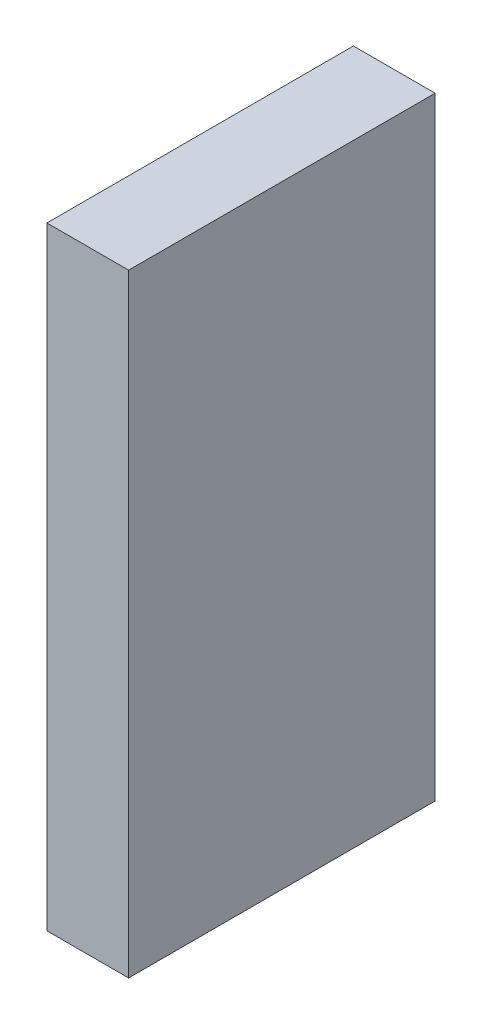
ISO-10303-21;
HEADER;
FILE_DESCRIPTION(('STEP AP214'),'2;1');
FILE_NAME('part.step','',(''),(''),'','','');
FILE_SCHEMA(('AUTOMOTIVE_DESIGN { 1 0 10303 214 1 1 1 1 }'));
ENDSEC;
DATA;
#1=APPLICATION_CONTEXT('core data for automotive mechanical design processes');
#2=APPLICATION_PROTOCOL_DEFINITION('international standard','automotive_design',2000,#1);
#3=PRODUCT_CONTEXT('',#1,'mechanical');
#4=PRODUCT('Part','Part','',(#3));
#5=PRODUCT_RELATED_PRODUCT_CATEGORY('part','',(#4));
#6=PRODUCT_DEFINITION_FORMATION('','',#4);
#7=PRODUCT_DEFINITION_CONTEXT('part definition',#1,'design');
#8=PRODUCT_DEFINITION('design','',#6,#7);
#9=PRODUCT_DEFINITION_SHAPE('','',#8);
#10=(LENGTH_UNIT() NAMED_UNIT(*) SI_UNIT(.MILLI.,.METRE.));
#11=(NAMED_UNIT(*) PLANE_ANGLE_UNIT() SI_UNIT($,.RADIAN.));
#12=(NAMED_UNIT(*) SI_UNIT($,.STERADIAN.) SOLID_ANGLE_UNIT());
#13=UNCERTAINTY_MEASURE_WITH_UNIT(LENGTH_MEASURE(1.E-05),#10,'distance_accuracy_value','');
#14=(GEOMETRIC_REPRESENTATION_CONTEXT(3) GLOBAL_UNCERTAINTY_ASSIGNED_CONTEXT((#13)) GLOBAL_UNIT_ASSIGNED_CONTEXT((#10,
#11,#12)) REPRESENTATION_CONTEXT('',''));
#15=CARTESIAN_POINT('',(0.,0.,0.));
#16=DIRECTION('',(0.,0.,1.));
#17=DIRECTION('',(1.,0.,0.));
#18=AXIS2_PLACEMENT_3D('',#15,#16,#17);
#19=CARTESIAN_POINT('',(4.,54.5304312197874,72.7494152004124));
#20=DIRECTION('',(0.,0.,-1.));
#21=DIRECTION('',(0.,1.,0.));
#22=AXIS2_PLACEMENT_3D('',#19,#20,#21);
#23=PLANE('',#22);
#24=DIRECTION('',(0.,-1.,0.));
#25=VECTOR('',#24,1.);
#26=CARTESIAN_POINT('',(0.,54.5304312197874,72.7494152004124));
#27=LINE('',#26,#25);
#28=CARTESIAN_POINT('',(0.,54.5304312197874,72.7494152004124));
#29=VERTEX_POINT('',#28);
#30=CARTESIAN_POINT('',(0.,24.5304312197874,72.7494152004124));
#31=VERTEX_POINT('',#30);
#32=EDGE_CURVE('E95',#29,#31,#27,.T.);
#33=ORIENTED_EDGE('',*,*,#32,.T.);
#34=DIRECTION('',(-1.,0.,0.));
#35=VECTOR('',#34,1.);
#36=CARTESIAN_POINT('',(4.,24.5304312197874,72.7494152004124));
#37=LINE('',#36,#35);
#38=CARTESIAN_POINT('',(4.,24.5304312197874,72.7494152004124));
#39=VERTEX_POINT('',#38);
#40=EDGE_CURVE('E11',#39,#31,#37,.T.);
#41=ORIENTED_EDGE('',*,*,#40,.F.);
#42=DIRECTION('',(0.,-1.,0.));
#43=VECTOR('',#42,1.);
#44=CARTESIAN_POINT('',(4.,54.5304312197874,72.7494152004124));
#45=LINE('',#44,#43);
#46=CARTESIAN_POINT('',(4.,54.5304312197874,72.7494152004124));
#47=VERTEX_POINT('',#46);
#48=EDGE_CURVE('E83',#47,#39,#45,.T.);
#49=ORIENTED_EDGE('',*,*,#48,.F.);
#50=DIRECTION('',(-1.,0.,0.));
#51=VECTOR('',#50,1.);
#52=CARTESIAN_POINT('',(4.,54.5304312197874,72.7494152004124));
#53=LINE('',#52,#51);
#54=EDGE_CURVE('E91',#47,#29,#53,.T.);
#55=ORIENTED_EDGE('',*,*,#54,.T.);
#56=EDGE_LOOP('',(#33,#41,#49,#55));
#57=FACE_BOUND('',#56,.T.);
#58=ADVANCED_FACE('F32',(#57),#23,.F.);
#59=CARTESIAN_POINT('',(4.,24.5304312197874,72.7494152004124));
#60=DIRECTION('',(0.,1.,0.));
#61=DIRECTION('',(0.,0.,1.));
#62=AXIS2_PLACEMENT_3D('',#59,#60,#61);
#63=PLANE('',#62);
#64=DIRECTION('',(0.,0.,-1.));
#65=VECTOR('',#64,1.);
#66=CARTESIAN_POINT('',(0.,24.5304312197874,72.7494152004124));
#67=LINE('',#66,#65);
#68=CARTESIAN_POINT('',(0.,24.5304312197874,57.7494152004124));
#69=VERTEX_POINT('',#68);
#70=EDGE_CURVE('E87',#31,#69,#67,.T.);
#71=ORIENTED_EDGE('',*,*,#70,.T.);
#72=DIRECTION('',(-1.,0.,0.));
#73=VECTOR('',#72,1.);
#74=CARTESIAN_POINT('',(4.,24.5304312197874,57.7494152004124));
#75=LINE('',#74,#73);
#76=CARTESIAN_POINT('',(4.,24.5304312197874,57.7494152004124));
#77=VERTEX_POINT('',#76);
#78=EDGE_CURVE('E40',#77,#69,#75,.T.);
#79=ORIENTED_EDGE('',*,*,#78,.F.);
#80=DIRECTION('',(0.,0.,-1.));
#81=VECTOR('',#80,1.);
#82=CARTESIAN_POINT('',(4.,24.5304312197874,72.7494152004124));
#83=LINE('',#82,#81);
#84=EDGE_CURVE('E78',#39,#77,#83,.T.);
#85=ORIENTED_EDGE('',*,*,#84,.F.);
#86=ORIENTED_EDGE('',*,*,#40,.T.);
#87=EDGE_LOOP('',(#71,#79,#85,#86));
#88=FACE_BOUND('',#87,.T.);
#89=ADVANCED_FACE('F86',(#88),#63,.F.);
#90=CARTESIAN_POINT('',(4.,54.5304312197874,57.7494152004124));
#91=DIRECTION('',(0.,0.,1.));
#92=DIRECTION('',(0.,-1.,0.));
#93=AXIS2_PLACEMENT_3D('',#90,#91,#92);
#94=PLANE('',#93);
#95=DIRECTION('',(0.,1.,0.));
#96=VECTOR('',#95,1.);
#97=CARTESIAN_POINT('',(0.,54.5304312197874,57.7494152004124));
#98=LINE('',#97,#96);
#99=CARTESIAN_POINT('',(0.,54.5304312197874,57.7494152004124));
#100=VERTEX_POINT('',#99);
#101=EDGE_CURVE('E65',#69,#100,#98,.T.);
#102=ORIENTED_EDGE('',*,*,#101,.T.);
#103=DIRECTION('',(-1.,0.,0.));
#104=VECTOR('',#103,1.);
#105=CARTESIAN_POINT('',(4.,54.5304312197874,57.7494152004124));
#106=LINE('',#105,#104);
#107=CARTESIAN_POINT('',(4.,54.5304312197874,57.7494152004124));
#108=VERTEX_POINT('',#107);
#109=EDGE_CURVE('E88',#108,#100,#106,.T.);
#110=ORIENTED_EDGE('',*,*,#109,.F.);
#111=DIRECTION('',(0.,1.,0.));
#112=VECTOR('',#111,1.);
#113=CARTESIAN_POINT('',(4.,54.5304312197874,57.7494152004124));
#114=LINE('',#113,#112);
#115=EDGE_CURVE('E81',#77,#108,#114,.T.);
#116=ORIENTED_EDGE('',*,*,#115,.F.);
#117=ORIENTED_EDGE('',*,*,#78,.T.);
#118=EDGE_LOOP('',(#102,#110,#116,#117));
#119=FACE_BOUND('',#118,.T.);
#120=ADVANCED_FACE('F89',(#119),#94,.F.);
#121=CARTESIAN_POINT('',(4.,54.5304312197874,72.7494152004124));
#122=DIRECTION('',(0.,-1.,0.));
#123=DIRECTION('',(0.,0.,-1.));
#124=AXIS2_PLACEMENT_3D('',#121,#122,#123);
#125=PLANE('',#124);
#126=DIRECTION('',(0.,0.,1.));
#127=VECTOR('',#126,1.);
#128=CARTESIAN_POINT('',(0.,54.5304312197874,72.7494152004124));
#129=LINE('',#128,#127);
#130=EDGE_CURVE('E71',#100,#29,#129,.T.);
#131=ORIENTED_EDGE('',*,*,#130,.T.);
#132=ORIENTED_EDGE('',*,*,#54,.F.);
#133=DIRECTION('',(0.,0.,1.));
#134=VECTOR('',#133,1.);
#135=CARTESIAN_POINT('',(4.,54.5304312197874,72.7494152004124));
#136=LINE('',#135,#134);
#137=EDGE_CURVE('E48',#108,#47,#136,.T.);
#138=ORIENTED_EDGE('',*,*,#137,.F.);
#139=ORIENTED_EDGE('',*,*,#109,.T.);
#140=EDGE_LOOP('',(#131,#132,#138,#139));
#141=FACE_BOUND('',#140,.T.);
#142=ADVANCED_FACE('F102',(#141),#125,.F.);
#143=CARTESIAN_POINT('',(4.,24.5304312197874,72.7494152004124));
#144=DIRECTION('',(1.,0.,0.));
#145=DIRECTION('',(0.,0.,-1.));
#146=AXIS2_PLACEMENT_3D('',#143,#144,#145);
#147=PLANE('',#146);
#148=ORIENTED_EDGE('',*,*,#48,.T.);
#149=ORIENTED_EDGE('',*,*,#84,.T.);
#150=ORIENTED_EDGE('',*,*,#115,.T.);
#151=ORIENTED_EDGE('',*,*,#137,.T.);
#152=EDGE_LOOP('',(#148,#149,#150,#151));
#153=FACE_BOUND('',#152,.T.);
#154=ADVANCED_FACE('F79',(#153),#147,.T.);
#155=CARTESIAN_POINT('',(0.,24.5304312197874,72.7494152004124));
#156=DIRECTION('',(1.,0.,0.));
#157=DIRECTION('',(0.,0.,-1.));
#158=AXIS2_PLACEMENT_3D('',#155,#156,#157);
#159=PLANE('',#158);
#160=ORIENTED_EDGE('',*,*,#32,.F.);
#161=ORIENTED_EDGE('',*,*,#130,.F.);
#162=ORIENTED_EDGE('',*,*,#101,.F.);
#163=ORIENTED_EDGE('',*,*,#70,.F.);
#164=EDGE_LOOP('',(#160,#161,#162,#163));
#165=FACE_BOUND('',#164,.T.);
#166=ADVANCED_FACE('F105',(#165),#159,.F.);
#167=CLOSED_SHELL('',(#58,#89,#120,#142,#154,#166));
#168=MANIFOLD_SOLID_BREP('B2',#167);
#169=ADVANCED_BREP_SHAPE_REPRESENTATION('',(#18,#168),#14);
#170=SHAPE_DEFINITION_REPRESENTATION(#9,#169);
ENDSEC;
END-ISO-10303-21;
